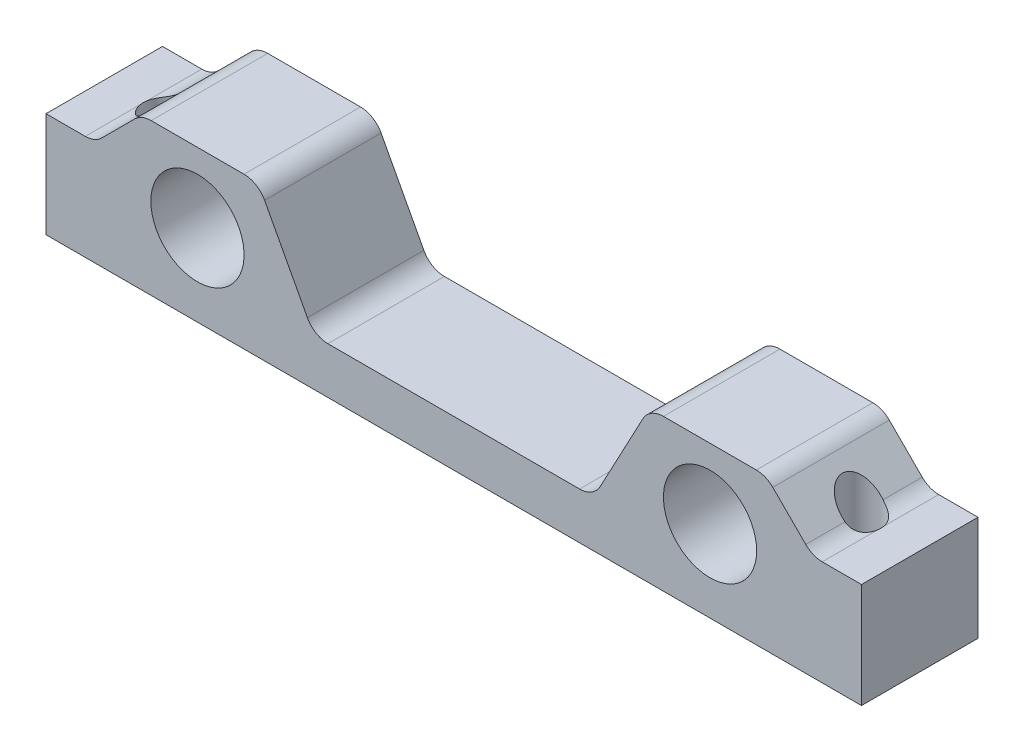
ISO-10303-21;
HEADER;
FILE_DESCRIPTION(('STEP AP214'),'2;1');
FILE_NAME('part.step','',(''),(''),'','','');
FILE_SCHEMA(('AUTOMOTIVE_DESIGN { 1 0 10303 214 1 1 1 1 }'));
ENDSEC;
DATA;
#1=APPLICATION_CONTEXT('core data for automotive mechanical design processes');
#2=APPLICATION_PROTOCOL_DEFINITION('international standard','automotive_design',2000,#1);
#3=PRODUCT_CONTEXT('',#1,'mechanical');
#4=PRODUCT('Part','Part','',(#3));
#5=PRODUCT_RELATED_PRODUCT_CATEGORY('part','',(#4));
#6=PRODUCT_DEFINITION_FORMATION('','',#4);
#7=PRODUCT_DEFINITION_CONTEXT('part definition',#1,'design');
#8=PRODUCT_DEFINITION('design','',#6,#7);
#9=PRODUCT_DEFINITION_SHAPE('','',#8);
#10=(LENGTH_UNIT() NAMED_UNIT(*) SI_UNIT(.MILLI.,.METRE.));
#11=(NAMED_UNIT(*) PLANE_ANGLE_UNIT() SI_UNIT($,.RADIAN.));
#12=(NAMED_UNIT(*) SI_UNIT($,.STERADIAN.) SOLID_ANGLE_UNIT());
#13=UNCERTAINTY_MEASURE_WITH_UNIT(LENGTH_MEASURE(1.E-05),#10,'distance_accuracy_value','');
#14=(GEOMETRIC_REPRESENTATION_CONTEXT(3) GLOBAL_UNCERTAINTY_ASSIGNED_CONTEXT((#13)) GLOBAL_UNIT_ASSIGNED_CONTEXT((#10,
#11,#12)) REPRESENTATION_CONTEXT('',''));
#15=CARTESIAN_POINT('',(0.,0.,0.));
#16=DIRECTION('',(0.,0.,1.));
#17=DIRECTION('',(1.,0.,0.));
#18=AXIS2_PLACEMENT_3D('',#15,#16,#17);
#19=CARTESIAN_POINT('',(31.6284271247462,11.,5.));
#20=DIRECTION('',(0.,0.,1.));
#21=DIRECTION('',(1.,0.,0.));
#22=AXIS2_PLACEMENT_3D('',#19,#20,#21);
#23=CYLINDRICAL_SURFACE('',#22,2.);
#24=DIRECTION('',(0.,0.,-1.));
#25=VECTOR('',#24,1.);
#26=CARTESIAN_POINT('',(31.6284271247462,9.,5.));
#27=LINE('',#26,#25);
#28=CARTESIAN_POINT('',(31.6284271247462,9.,0.265941909805075));
#29=VERTEX_POINT('',#28);
#30=CARTESIAN_POINT('',(31.6284271247462,9.,5.));
#31=VERTEX_POINT('',#30);
#32=EDGE_CURVE('E239',#29,#31,#27,.F.);
#33=ORIENTED_EDGE('',*,*,#32,.F.);
#34=CARTESIAN_POINT('',(31.6284271247462,9.,0.265941909805074));
#35=CARTESIAN_POINT('',(31.621127831852,9.00000971552875,0.310662451399119));
#36=CARTESIAN_POINT('',(31.6119785573823,9.00004017859814,0.355079514265546));
#37=CARTESIAN_POINT('',(31.5900591601242,9.00033544474956,0.44301475024879));
#38=CARTESIAN_POINT('',(31.5772886854256,9.0006002706124,0.486532835561299));
#39=CARTESIAN_POINT('',(31.5481672998002,9.00155850160956,0.572487890355647));
#40=CARTESIAN_POINT('',(31.5318065990873,9.00225308822136,0.614921542548558));
#41=CARTESIAN_POINT('',(31.4956562322412,9.00432988148771,0.698268772917775));
#42=CARTESIAN_POINT('',(31.4758667090317,9.00571205948583,0.73918241436649));
#43=CARTESIAN_POINT('',(31.4114723830346,9.01133260970605,0.85935523220246));
#44=CARTESIAN_POINT('',(31.3618708175915,9.0170451727348,0.935960977413042));
#45=CARTESIAN_POINT('',(31.2512640163631,9.03509143259801,1.07936191713064));
#46=CARTESIAN_POINT('',(31.1902791374809,9.04741338237266,1.14617425032728));
#47=CARTESIAN_POINT('',(31.0631193291675,9.0804953506657,1.26468011590106));
#48=CARTESIAN_POINT('',(30.9973970362461,9.10076831858177,1.31699155259397));
#49=CARTESIAN_POINT('',(30.8615448749838,9.15145352436031,1.4096061400553));
#50=CARTESIAN_POINT('',(30.7914169694037,9.18186127267306,1.44991459301451));
#51=CARTESIAN_POINT('',(30.6573749746826,9.25009117763731,1.51505623876631));
#52=CARTESIAN_POINT('',(30.5934956526785,9.28694917584134,1.54098705040206));
#53=CARTESIAN_POINT('',(30.4682018225293,9.36920771489363,1.58356067225445));
#54=CARTESIAN_POINT('',(30.4067869213124,9.41460688681265,1.60020496916628));
#55=CARTESIAN_POINT('',(30.324709691245,9.4830186246566,1.61790772536496));
#56=CARTESIAN_POINT('',(30.3019941432116,9.50283904814436,1.6222866288439));
#57=CARTESIAN_POINT('',(30.2574428792265,9.54352923400787,1.62994802334597));
#58=CARTESIAN_POINT('',(30.235604978577,9.56439605718387,1.63323340701303));
#59=CARTESIAN_POINT('',(30.2142135623731,9.58578643762691,1.63603561993479));
#60=B_SPLINE_CURVE_WITH_KNOTS('',3,(#34,#35,#36,#37,#38,#39,#40,#41,#42,#43,#44,#45,#46,#47,#48,
#49,#50,#51,#52,#53,#54,#55,#56,#57,#58,#59),.UNSPECIFIED.,.F.,.F.,(4,2,2,2,2,2,2,2,2,2,2,2,4),
(0.,0.135895733799582,0.271804678547935,0.408088928006801,0.54436749808707,0.817191567087051,
1.08953233671039,1.3472932335245,1.60494009770677,1.83839718002303,2.07181687703452,
2.16316987853132,2.25427927064066),.UNSPECIFIED.);
#61=CARTESIAN_POINT('',(30.2142135623731,9.58578643762691,1.63603561993479));
#62=VERTEX_POINT('',#61);
#63=EDGE_CURVE('E11',#29,#62,#60,.T.);
#64=ORIENTED_EDGE('',*,*,#63,.T.);
#65=DIRECTION('',(0.,0.,-1.));
#66=VECTOR('',#65,1.);
#67=CARTESIAN_POINT('',(30.2142135623731,9.58578643762691,-5.));
#68=LINE('',#67,#66);
#69=CARTESIAN_POINT('',(30.2142135623731,9.58578643762691,5.));
#70=VERTEX_POINT('',#69);
#71=EDGE_CURVE('E226',#70,#62,#68,.T.);
#72=ORIENTED_EDGE('',*,*,#71,.F.);
#73=CARTESIAN_POINT('',(31.6284271247462,11.,5.));
#74=DIRECTION('',(0.,0.,-1.));
#75=DIRECTION('',(-1.,0.,0.));
#76=AXIS2_PLACEMENT_3D('',#73,#74,#75);
#77=CIRCLE('',#76,2.);
#78=EDGE_CURVE('E255',#31,#70,#77,.T.);
#79=ORIENTED_EDGE('',*,*,#78,.F.);
#80=EDGE_LOOP('',(#33,#64,#72,#79));
#81=FACE_BOUND('',#80,.T.);
#82=ADVANCED_FACE('F46',(#81),#23,.F.);
#83=CARTESIAN_POINT('',(-31.6284271247462,11.,5.));
#84=DIRECTION('',(0.,0.,1.));
#85=DIRECTION('',(1.,0.,0.));
#86=AXIS2_PLACEMENT_3D('',#83,#84,#85);
#87=CYLINDRICAL_SURFACE('',#86,2.);
#88=DIRECTION('',(0.,0.,-1.));
#89=VECTOR('',#88,1.);
#90=CARTESIAN_POINT('',(-30.2142135623731,9.58578643762691,5.));
#91=LINE('',#90,#89);
#92=CARTESIAN_POINT('',(-30.2142135623731,9.58578643762691,1.63603561993478));
#93=VERTEX_POINT('',#92);
#94=CARTESIAN_POINT('',(-30.2142135623731,9.58578643762691,5.));
#95=VERTEX_POINT('',#94);
#96=EDGE_CURVE('E472',#93,#95,#91,.F.);
#97=ORIENTED_EDGE('',*,*,#96,.F.);
#98=CARTESIAN_POINT('',(-30.2142135623731,9.58578643762691,1.63603561993478));
#99=CARTESIAN_POINT('',(-30.2430124964492,9.55697701470364,1.6322668471346));
#100=CARTESIAN_POINT('',(-30.2726510344877,9.52910887774639,1.62761043362416));
#101=CARTESIAN_POINT('',(-30.3333641502774,9.47538578193443,1.61626773968908));
#102=CARTESIAN_POINT('',(-30.3644396588817,9.44953215801428,1.60958012740766));
#103=CARTESIAN_POINT('',(-30.4277769358833,9.39998196945452,1.59391684706635));
#104=CARTESIAN_POINT('',(-30.4600398692527,9.3762876069667,1.58493887782779));
#105=CARTESIAN_POINT('',(-30.5253647318776,9.33121843055241,1.56450198862892));
#106=CARTESIAN_POINT('',(-30.5584264613024,9.30984304369803,1.55304368356733));
#107=CARTESIAN_POINT('',(-30.6585898278529,9.24914411761824,1.51455142426167));
#108=CARTESIAN_POINT('',(-30.7264221336925,9.21343890838563,1.48345698607709));
#109=CARTESIAN_POINT('',(-30.860259303265,9.15193281366341,1.4100602560433));
#110=CARTESIAN_POINT('',(-30.926267341295,9.1261135680551,1.36777898976578));
#111=CARTESIAN_POINT('',(-31.0494557916138,9.08459654272158,1.27542736857176));
#112=CARTESIAN_POINT('',(-31.1069279197647,9.06838679187342,1.2259722455492));
#113=CARTESIAN_POINT('',(-31.2152285661413,9.0423536241548,1.11872160915702));
#114=CARTESIAN_POINT('',(-31.2660492274388,9.03253770644264,1.06091639888236));
#115=CARTESIAN_POINT('',(-31.3617963127153,9.01722751049113,0.935190957920211));
#116=CARTESIAN_POINT('',(-31.406272936153,9.01198730623311,0.866898913947614));
#117=CARTESIAN_POINT('',(-31.4847077656438,9.00478077183349,0.724399481383092));
#118=CARTESIAN_POINT('',(-31.5186698449035,9.00281323497998,0.650194283695164));
#119=CARTESIAN_POINT('',(-31.5654856982409,9.00090466283946,0.524016182864021));
#120=CARTESIAN_POINT('',(-31.5815780266026,9.00049825109698,0.473223642245167));
#121=CARTESIAN_POINT('',(-31.6087638403447,9.00005476682683,0.37041062173159));
#122=CARTESIAN_POINT('',(-31.6198659671162,9.00001705346553,0.318392429992984));
#123=CARTESIAN_POINT('',(-31.6284271247462,9.,0.265941909805161));
#124=B_SPLINE_CURVE_WITH_KNOTS('',3,(#98,#99,#100,#101,#102,#103,#104,#105,#106,#107,#108,#109,
#110,#111,#112,#113,#114,#115,#116,#117,#118,#119,#120,#121,#122,#123),.UNSPECIFIED.,.F.,.F.,(4,
2,2,2,2,2,2,2,2,2,2,2,4),(0.,0.122713395548171,0.245507428601872,0.368425325145743,
0.491312784007391,0.738028301882362,0.98428337349463,1.21584605216557,1.44767983788197,
1.6916906486659,1.93561146677952,2.09522634897243,2.25456375555555),.UNSPECIFIED.);
#125=CARTESIAN_POINT('',(-31.6284271247462,9.,0.265941909805164));
#126=VERTEX_POINT('',#125);
#127=EDGE_CURVE('E217',#93,#126,#124,.T.);
#128=ORIENTED_EDGE('',*,*,#127,.T.);
#129=DIRECTION('',(0.,0.,-1.));
#130=VECTOR('',#129,1.);
#131=CARTESIAN_POINT('',(-31.6284271247462,9.,-5.));
#132=LINE('',#131,#130);
#133=CARTESIAN_POINT('',(-31.6284271247462,9.,5.));
#134=VERTEX_POINT('',#133);
#135=EDGE_CURVE('E468',#134,#126,#132,.T.);
#136=ORIENTED_EDGE('',*,*,#135,.F.);
#137=CARTESIAN_POINT('',(-31.6284271247462,11.,5.));
#138=DIRECTION('',(0.,0.,-1.));
#139=DIRECTION('',(-1.,0.,0.));
#140=AXIS2_PLACEMENT_3D('',#137,#138,#139);
#141=CIRCLE('',#140,2.);
#142=EDGE_CURVE('E244',#95,#134,#141,.T.);
#143=ORIENTED_EDGE('',*,*,#142,.F.);
#144=EDGE_LOOP('',(#97,#128,#136,#143));
#145=FACE_BOUND('',#144,.T.);
#146=ADVANCED_FACE('F294',(#145),#87,.F.);
#147=CARTESIAN_POINT('',(0.,0.,5.));
#148=DIRECTION('',(0.,0.,-1.));
#149=DIRECTION('',(-1.,0.,0.));
#150=AXIS2_PLACEMENT_3D('',#147,#148,#149);
#151=PLANE('',#150);
#152=DIRECTION('',(-1.,0.,0.));
#153=VECTOR('',#152,1.);
#154=CARTESIAN_POINT('',(-26.8,13.,5.));
#155=LINE('',#154,#153);
#156=CARTESIAN_POINT('',(-18.,13.,5.));
#157=VERTEX_POINT('',#156);
#158=CARTESIAN_POINT('',(-25.9715728752538,13.,5.));
#159=VERTEX_POINT('',#158);
#160=EDGE_CURVE('E506',#157,#159,#155,.T.);
#161=ORIENTED_EDGE('',*,*,#160,.T.);
#162=CARTESIAN_POINT('',(-25.9715728752538,11.,5.));
#163=DIRECTION('',(0.,0.,-1.));
#164=DIRECTION('',(-1.,0.,0.));
#165=AXIS2_PLACEMENT_3D('',#162,#163,#164);
#166=CIRCLE('',#165,2.);
#167=CARTESIAN_POINT('',(-27.3857864376269,12.4142135623731,5.));
#168=VERTEX_POINT('',#167);
#169=EDGE_CURVE('E388',#159,#168,#166,.F.);
#170=ORIENTED_EDGE('',*,*,#169,.T.);
#171=DIRECTION('',(-0.707106781186546,-0.707106781186548,0.));
#172=VECTOR('',#171,1.);
#173=CARTESIAN_POINT('',(-30.8,9.,5.));
#174=LINE('',#173,#172);
#175=EDGE_CURVE('E508',#168,#95,#174,.T.);
#176=ORIENTED_EDGE('',*,*,#175,.T.);
#177=ORIENTED_EDGE('',*,*,#142,.T.);
#178=DIRECTION('',(-1.,0.,0.));
#179=VECTOR('',#178,1.);
#180=CARTESIAN_POINT('',(-35.,9.,5.));
#181=LINE('',#180,#179);
#182=CARTESIAN_POINT('',(-35.,9.,5.));
#183=VERTEX_POINT('',#182);
#184=EDGE_CURVE('E458',#134,#183,#181,.T.);
#185=ORIENTED_EDGE('',*,*,#184,.T.);
#186=DIRECTION('',(0.,-1.,0.));
#187=VECTOR('',#186,1.);
#188=CARTESIAN_POINT('',(-35.,0.,5.));
#189=LINE('',#188,#187);
#190=CARTESIAN_POINT('',(-35.,0.,5.));
#191=VERTEX_POINT('',#190);
#192=EDGE_CURVE('E453',#183,#191,#189,.T.);
#193=ORIENTED_EDGE('',*,*,#192,.T.);
#194=DIRECTION('',(1.,0.,0.));
#195=VECTOR('',#194,1.);
#196=CARTESIAN_POINT('',(-35.,0.,5.));
#197=LINE('',#196,#195);
#198=CARTESIAN_POINT('',(35.,0.,5.));
#199=VERTEX_POINT('',#198);
#200=EDGE_CURVE('E531',#191,#199,#197,.T.);
#201=ORIENTED_EDGE('',*,*,#200,.T.);
#202=DIRECTION('',(0.,1.,0.));
#203=VECTOR('',#202,1.);
#204=CARTESIAN_POINT('',(35.,0.,5.));
#205=LINE('',#204,#203);
#206=CARTESIAN_POINT('',(35.,9.00000000000001,5.));
#207=VERTEX_POINT('',#206);
#208=EDGE_CURVE('E527',#199,#207,#205,.T.);
#209=ORIENTED_EDGE('',*,*,#208,.T.);
#210=DIRECTION('',(-1.,0.,0.));
#211=VECTOR('',#210,1.);
#212=CARTESIAN_POINT('',(35.,9.00000000000001,5.));
#213=LINE('',#212,#211);
#214=EDGE_CURVE('E526',#207,#31,#213,.T.);
#215=ORIENTED_EDGE('',*,*,#214,.T.);
#216=ORIENTED_EDGE('',*,*,#78,.T.);
#217=DIRECTION('',(-0.707106781186547,0.707106781186548,0.));
#218=VECTOR('',#217,1.);
#219=CARTESIAN_POINT('',(30.8,9.,5.));
#220=LINE('',#219,#218);
#221=CARTESIAN_POINT('',(27.3857864376269,12.4142135623731,5.));
#222=VERTEX_POINT('',#221);
#223=EDGE_CURVE('E500',#70,#222,#220,.T.);
#224=ORIENTED_EDGE('',*,*,#223,.T.);
#225=CARTESIAN_POINT('',(25.9715728752538,11.,5.));
#226=DIRECTION('',(0.,0.,-1.));
#227=DIRECTION('',(-1.,0.,0.));
#228=AXIS2_PLACEMENT_3D('',#225,#226,#227);
#229=CIRCLE('',#228,2.);
#230=CARTESIAN_POINT('',(25.9715728752538,13.,5.));
#231=VERTEX_POINT('',#230);
#232=EDGE_CURVE('E486',#222,#231,#229,.F.);
#233=ORIENTED_EDGE('',*,*,#232,.T.);
#234=DIRECTION('',(-1.,0.,0.));
#235=VECTOR('',#234,1.);
#236=CARTESIAN_POINT('',(26.8,13.,5.));
#237=LINE('',#236,#235);
#238=CARTESIAN_POINT('',(18.,13.,5.));
#239=VERTEX_POINT('',#238);
#240=EDGE_CURVE('E423',#231,#239,#237,.T.);
#241=ORIENTED_EDGE('',*,*,#240,.T.);
#242=CARTESIAN_POINT('',(18.,11.,5.));
#243=DIRECTION('',(0.,0.,-1.));
#244=DIRECTION('',(-1.,0.,0.));
#245=AXIS2_PLACEMENT_3D('',#242,#243,#244);
#246=CIRCLE('',#245,2.);
#247=CARTESIAN_POINT('',(16.2352941176471,11.9411764705882,5.));
#248=VERTEX_POINT('',#247);
#249=EDGE_CURVE('E401',#239,#248,#246,.F.);
#250=ORIENTED_EDGE('',*,*,#249,.T.);
#251=DIRECTION('',(-0.470588235294119,-0.88235294117647,0.));
#252=VECTOR('',#251,1.);
#253=CARTESIAN_POINT('',(16.8,13.,5.));
#254=LINE('',#253,#252);
#255=CARTESIAN_POINT('',(12.5647058823529,5.05882352941176,5.));
#256=VERTEX_POINT('',#255);
#257=EDGE_CURVE('E491',#248,#256,#254,.T.);
#258=ORIENTED_EDGE('',*,*,#257,.T.);
#259=CARTESIAN_POINT('',(10.8,6.,5.));
#260=DIRECTION('',(0.,0.,-1.));
#261=DIRECTION('',(-1.,0.,0.));
#262=AXIS2_PLACEMENT_3D('',#259,#260,#261);
#263=CIRCLE('',#262,2.);
#264=CARTESIAN_POINT('',(10.8,4.,5.));
#265=VERTEX_POINT('',#264);
#266=EDGE_CURVE('E252',#256,#265,#263,.T.);
#267=ORIENTED_EDGE('',*,*,#266,.T.);
#268=DIRECTION('',(-1.,0.,0.));
#269=VECTOR('',#268,1.);
#270=CARTESIAN_POINT('',(12.,4.,5.));
#271=LINE('',#270,#269);
#272=CARTESIAN_POINT('',(-10.8,4.,5.));
#273=VERTEX_POINT('',#272);
#274=EDGE_CURVE('E495',#265,#273,#271,.T.);
#275=ORIENTED_EDGE('',*,*,#274,.T.);
#276=CARTESIAN_POINT('',(-10.8,6.,5.));
#277=DIRECTION('',(0.,0.,-1.));
#278=DIRECTION('',(-1.,0.,0.));
#279=AXIS2_PLACEMENT_3D('',#276,#277,#278);
#280=CIRCLE('',#279,2.);
#281=CARTESIAN_POINT('',(-12.5647058823529,5.05882352941176,5.));
#282=VERTEX_POINT('',#281);
#283=EDGE_CURVE('E248',#273,#282,#280,.T.);
#284=ORIENTED_EDGE('',*,*,#283,.T.);
#285=DIRECTION('',(-0.47058823529412,0.88235294117647,0.));
#286=VECTOR('',#285,1.);
#287=CARTESIAN_POINT('',(-16.8,13.,5.));
#288=LINE('',#287,#286);
#289=CARTESIAN_POINT('',(-16.2352941176471,11.9411764705882,5.));
#290=VERTEX_POINT('',#289);
#291=EDGE_CURVE('E498',#282,#290,#288,.T.);
#292=ORIENTED_EDGE('',*,*,#291,.T.);
#293=CARTESIAN_POINT('',(-18.,11.,5.));
#294=DIRECTION('',(0.,0.,-1.));
#295=DIRECTION('',(-1.,0.,0.));
#296=AXIS2_PLACEMENT_3D('',#293,#294,#295);
#297=CIRCLE('',#296,2.);
#298=EDGE_CURVE('E396',#290,#157,#297,.F.);
#299=ORIENTED_EDGE('',*,*,#298,.T.);
#300=EDGE_LOOP('',(#161,#170,#176,#177,#185,#193,#201,#209,#215,#216,#224,#233,#241,#250,#258,
#267,#275,#284,#292,#299));
#301=FACE_BOUND('',#300,.T.);
#302=CARTESIAN_POINT('',(22.,7.00000000000001,5.));
#303=DIRECTION('',(0.,0.,1.));
#304=DIRECTION('',(1.,0.,0.));
#305=AXIS2_PLACEMENT_3D('',#302,#303,#304);
#306=CIRCLE('',#305,4.);
#307=CARTESIAN_POINT('',(26.,7.00000000000001,5.));
#308=VERTEX_POINT('',#307);
#309=EDGE_CURVE('E514',#308,#308,#306,.T.);
#310=ORIENTED_EDGE('',*,*,#309,.F.);
#311=EDGE_LOOP('',(#310));
#312=FACE_BOUND('',#311,.T.);
#313=CARTESIAN_POINT('',(-22.,7.00000000000001,5.));
#314=DIRECTION('',(0.,0.,1.));
#315=DIRECTION('',(-1.,0.,0.));
#316=AXIS2_PLACEMENT_3D('',#313,#314,#315);
#317=CIRCLE('',#316,4.);
#318=CARTESIAN_POINT('',(-26.,7.00000000000001,5.));
#319=VERTEX_POINT('',#318);
#320=EDGE_CURVE('E538',#319,#319,#317,.T.);
#321=ORIENTED_EDGE('',*,*,#320,.F.);
#322=EDGE_LOOP('',(#321));
#323=FACE_BOUND('',#322,.T.);
#324=ADVANCED_FACE('F290',(#301,#312,#323),#151,.F.);
#325=CARTESIAN_POINT('',(0.,0.,-5.));
#326=DIRECTION('',(0.,0.,-1.));
#327=DIRECTION('',(-1.,0.,0.));
#328=AXIS2_PLACEMENT_3D('',#325,#326,#327);
#329=PLANE('',#328);
#330=CARTESIAN_POINT('',(22.,7.00000000000001,-5.));
#331=DIRECTION('',(0.,0.,1.));
#332=DIRECTION('',(1.,0.,0.));
#333=AXIS2_PLACEMENT_3D('',#330,#331,#332);
#334=CIRCLE('',#333,4.);
#335=CARTESIAN_POINT('',(26.,7.00000000000001,-5.));
#336=VERTEX_POINT('',#335);
#337=EDGE_CURVE('E535',#336,#336,#334,.T.);
#338=ORIENTED_EDGE('',*,*,#337,.T.);
#339=EDGE_LOOP('',(#338));
#340=FACE_BOUND('',#339,.T.);
#341=DIRECTION('',(-0.707106781186546,-0.707106781186548,0.));
#342=VECTOR('',#341,1.);
#343=CARTESIAN_POINT('',(-30.8,9.,-5.));
#344=LINE('',#343,#342);
#345=CARTESIAN_POINT('',(-27.3857864376269,12.4142135623731,-5.));
#346=VERTEX_POINT('',#345);
#347=CARTESIAN_POINT('',(-30.2142135623731,9.58578643762691,-5.));
#348=VERTEX_POINT('',#347);
#349=EDGE_CURVE('E448',#346,#348,#344,.T.);
#350=ORIENTED_EDGE('',*,*,#349,.F.);
#351=CARTESIAN_POINT('',(-25.9715728752538,11.,-5.));
#352=DIRECTION('',(0.,0.,-1.));
#353=DIRECTION('',(-1.,0.,0.));
#354=AXIS2_PLACEMENT_3D('',#351,#352,#353);
#355=CIRCLE('',#354,2.);
#356=CARTESIAN_POINT('',(-25.9715728752538,13.,-5.));
#357=VERTEX_POINT('',#356);
#358=EDGE_CURVE('E480',#346,#357,#355,.T.);
#359=ORIENTED_EDGE('',*,*,#358,.T.);
#360=DIRECTION('',(-1.,0.,0.));
#361=VECTOR('',#360,1.);
#362=CARTESIAN_POINT('',(-26.8,13.,-5.));
#363=LINE('',#362,#361);
#364=CARTESIAN_POINT('',(-18.,13.,-5.));
#365=VERTEX_POINT('',#364);
#366=EDGE_CURVE('E445',#365,#357,#363,.T.);
#367=ORIENTED_EDGE('',*,*,#366,.F.);
#368=CARTESIAN_POINT('',(-18.,11.,-5.));
#369=DIRECTION('',(0.,0.,-1.));
#370=DIRECTION('',(-1.,0.,0.));
#371=AXIS2_PLACEMENT_3D('',#368,#369,#370);
#372=CIRCLE('',#371,2.);
#373=CARTESIAN_POINT('',(-16.2352941176471,11.9411764705882,-5.));
#374=VERTEX_POINT('',#373);
#375=EDGE_CURVE('E478',#365,#374,#372,.T.);
#376=ORIENTED_EDGE('',*,*,#375,.T.);
#377=DIRECTION('',(-0.47058823529412,0.88235294117647,0.));
#378=VECTOR('',#377,1.);
#379=CARTESIAN_POINT('',(-16.8,13.,-5.));
#380=LINE('',#379,#378);
#381=CARTESIAN_POINT('',(-12.5647058823529,5.05882352941176,-5.));
#382=VERTEX_POINT('',#381);
#383=EDGE_CURVE('E442',#382,#374,#380,.T.);
#384=ORIENTED_EDGE('',*,*,#383,.F.);
#385=CARTESIAN_POINT('',(-10.8,6.,-5.));
#386=DIRECTION('',(0.,0.,-1.));
#387=DIRECTION('',(-1.,0.,0.));
#388=AXIS2_PLACEMENT_3D('',#385,#386,#387);
#389=CIRCLE('',#388,2.);
#390=CARTESIAN_POINT('',(-10.8,4.,-5.));
#391=VERTEX_POINT('',#390);
#392=EDGE_CURVE('E246',#382,#391,#389,.F.);
#393=ORIENTED_EDGE('',*,*,#392,.T.);
#394=DIRECTION('',(-1.,0.,0.));
#395=VECTOR('',#394,1.);
#396=CARTESIAN_POINT('',(12.,4.,-5.));
#397=LINE('',#396,#395);
#398=CARTESIAN_POINT('',(10.8,4.,-5.));
#399=VERTEX_POINT('',#398);
#400=EDGE_CURVE('E434',#399,#391,#397,.T.);
#401=ORIENTED_EDGE('',*,*,#400,.F.);
#402=CARTESIAN_POINT('',(10.8,6.,-5.));
#403=DIRECTION('',(0.,0.,-1.));
#404=DIRECTION('',(-1.,0.,0.));
#405=AXIS2_PLACEMENT_3D('',#402,#403,#404);
#406=CIRCLE('',#405,2.);
#407=CARTESIAN_POINT('',(12.5647058823529,5.05882352941176,-5.));
#408=VERTEX_POINT('',#407);
#409=EDGE_CURVE('E250',#399,#408,#406,.F.);
#410=ORIENTED_EDGE('',*,*,#409,.T.);
#411=DIRECTION('',(-0.470588235294119,-0.88235294117647,0.));
#412=VECTOR('',#411,1.);
#413=CARTESIAN_POINT('',(16.8,13.,-5.));
#414=LINE('',#413,#412);
#415=CARTESIAN_POINT('',(16.2352941176471,11.9411764705882,-5.));
#416=VERTEX_POINT('',#415);
#417=EDGE_CURVE('E430',#416,#408,#414,.T.);
#418=ORIENTED_EDGE('',*,*,#417,.F.);
#419=CARTESIAN_POINT('',(18.,11.,-5.));
#420=DIRECTION('',(0.,0.,-1.));
#421=DIRECTION('',(-1.,0.,0.));
#422=AXIS2_PLACEMENT_3D('',#419,#420,#421);
#423=CIRCLE('',#422,2.);
#424=CARTESIAN_POINT('',(18.,13.,-5.));
#425=VERTEX_POINT('',#424);
#426=EDGE_CURVE('E429',#416,#425,#423,.T.);
#427=ORIENTED_EDGE('',*,*,#426,.T.);
#428=DIRECTION('',(-1.,0.,0.));
#429=VECTOR('',#428,1.);
#430=CARTESIAN_POINT('',(26.8,13.,-5.));
#431=LINE('',#430,#429);
#432=CARTESIAN_POINT('',(25.9715728752538,13.,-5.));
#433=VERTEX_POINT('',#432);
#434=EDGE_CURVE('E420',#433,#425,#431,.T.);
#435=ORIENTED_EDGE('',*,*,#434,.F.);
#436=CARTESIAN_POINT('',(25.9715728752538,11.,-5.));
#437=DIRECTION('',(0.,0.,-1.));
#438=DIRECTION('',(-1.,0.,0.));
#439=AXIS2_PLACEMENT_3D('',#436,#437,#438);
#440=CIRCLE('',#439,2.);
#441=CARTESIAN_POINT('',(27.3857864376269,12.4142135623731,-5.));
#442=VERTEX_POINT('',#441);
#443=EDGE_CURVE('E427',#433,#442,#440,.T.);
#444=ORIENTED_EDGE('',*,*,#443,.T.);
#445=DIRECTION('',(-0.707106781186547,0.707106781186548,0.));
#446=VECTOR('',#445,1.);
#447=CARTESIAN_POINT('',(30.8,9.,-5.));
#448=LINE('',#447,#446);
#449=CARTESIAN_POINT('',(30.2142135623731,9.58578643762691,-5.));
#450=VERTEX_POINT('',#449);
#451=EDGE_CURVE('E431',#450,#442,#448,.T.);
#452=ORIENTED_EDGE('',*,*,#451,.F.);
#453=CARTESIAN_POINT('',(31.6284271247462,11.,-5.));
#454=DIRECTION('',(0.,0.,-1.));
#455=DIRECTION('',(-1.,0.,0.));
#456=AXIS2_PLACEMENT_3D('',#453,#454,#455);
#457=CIRCLE('',#456,2.);
#458=CARTESIAN_POINT('',(31.6284271247462,9.,-5.));
#459=VERTEX_POINT('',#458);
#460=EDGE_CURVE('E229',#450,#459,#457,.F.);
#461=ORIENTED_EDGE('',*,*,#460,.T.);
#462=DIRECTION('',(-1.,0.,0.));
#463=VECTOR('',#462,1.);
#464=CARTESIAN_POINT('',(35.,9.00000000000001,-5.));
#465=LINE('',#464,#463);
#466=CARTESIAN_POINT('',(35.,9.00000000000001,-5.));
#467=VERTEX_POINT('',#466);
#468=EDGE_CURVE('E436',#467,#459,#465,.T.);
#469=ORIENTED_EDGE('',*,*,#468,.F.);
#470=DIRECTION('',(0.,1.,0.));
#471=VECTOR('',#470,1.);
#472=CARTESIAN_POINT('',(35.,0.,-5.));
#473=LINE('',#472,#471);
#474=CARTESIAN_POINT('',(35.,0.,-5.));
#475=VERTEX_POINT('',#474);
#476=EDGE_CURVE('E516',#475,#467,#473,.T.);
#477=ORIENTED_EDGE('',*,*,#476,.F.);
#478=DIRECTION('',(1.,0.,0.));
#479=VECTOR('',#478,1.);
#480=CARTESIAN_POINT('',(-35.,0.,-5.));
#481=LINE('',#480,#479);
#482=CARTESIAN_POINT('',(-35.,0.,-5.));
#483=VERTEX_POINT('',#482);
#484=EDGE_CURVE('E513',#483,#475,#481,.T.);
#485=ORIENTED_EDGE('',*,*,#484,.F.);
#486=DIRECTION('',(0.,-1.,0.));
#487=VECTOR('',#486,1.);
#488=CARTESIAN_POINT('',(-35.,0.,-5.));
#489=LINE('',#488,#487);
#490=CARTESIAN_POINT('',(-35.,9.,-5.));
#491=VERTEX_POINT('',#490);
#492=EDGE_CURVE('E511',#491,#483,#489,.T.);
#493=ORIENTED_EDGE('',*,*,#492,.F.);
#494=DIRECTION('',(-1.,0.,0.));
#495=VECTOR('',#494,1.);
#496=CARTESIAN_POINT('',(-35.,9.,-5.));
#497=LINE('',#496,#495);
#498=CARTESIAN_POINT('',(-31.6284271247462,9.,-5.));
#499=VERTEX_POINT('',#498);
#500=EDGE_CURVE('E451',#499,#491,#497,.T.);
#501=ORIENTED_EDGE('',*,*,#500,.F.);
#502=CARTESIAN_POINT('',(-31.6284271247462,11.,-5.));
#503=DIRECTION('',(0.,0.,-1.));
#504=DIRECTION('',(-1.,0.,0.));
#505=AXIS2_PLACEMENT_3D('',#502,#503,#504);
#506=CIRCLE('',#505,2.);
#507=EDGE_CURVE('E242',#499,#348,#506,.F.);
#508=ORIENTED_EDGE('',*,*,#507,.T.);
#509=EDGE_LOOP('',(#350,#359,#367,#376,#384,#393,#401,#410,#418,#427,#435,#444,#452,#461,#469,
#477,#485,#493,#501,#508));
#510=FACE_BOUND('',#509,.T.);
#511=CARTESIAN_POINT('',(-22.,7.00000000000001,-5.));
#512=DIRECTION('',(0.,0.,1.));
#513=DIRECTION('',(-1.,0.,0.));
#514=AXIS2_PLACEMENT_3D('',#511,#512,#513);
#515=CIRCLE('',#514,4.);
#516=CARTESIAN_POINT('',(-26.,7.00000000000001,-5.));
#517=VERTEX_POINT('',#516);
#518=EDGE_CURVE('E541',#517,#517,#515,.T.);
#519=ORIENTED_EDGE('',*,*,#518,.T.);
#520=EDGE_LOOP('',(#519));
#521=FACE_BOUND('',#520,.T.);
#522=ADVANCED_FACE('F293',(#340,#510,#521),#329,.T.);
#523=CARTESIAN_POINT('',(-35.,0.,5.));
#524=DIRECTION('',(1.,0.,0.));
#525=DIRECTION('',(0.,0.,-1.));
#526=AXIS2_PLACEMENT_3D('',#523,#524,#525);
#527=PLANE('',#526);
#528=ORIENTED_EDGE('',*,*,#492,.T.);
#529=DIRECTION('',(0.,0.,-1.));
#530=VECTOR('',#529,1.);
#531=CARTESIAN_POINT('',(-35.,0.,5.));
#532=LINE('',#531,#530);
#533=EDGE_CURVE('E464',#191,#483,#532,.T.);
#534=ORIENTED_EDGE('',*,*,#533,.F.);
#535=ORIENTED_EDGE('',*,*,#192,.F.);
#536=DIRECTION('',(0.,0.,-1.));
#537=VECTOR('',#536,1.);
#538=CARTESIAN_POINT('',(-35.,9.,5.));
#539=LINE('',#538,#537);
#540=EDGE_CURVE('E454',#183,#491,#539,.T.);
#541=ORIENTED_EDGE('',*,*,#540,.T.);
#542=EDGE_LOOP('',(#528,#534,#535,#541));
#543=FACE_BOUND('',#542,.T.);
#544=ADVANCED_FACE('F298',(#543),#527,.F.);
#545=CARTESIAN_POINT('',(-35.,0.,5.));
#546=DIRECTION('',(0.,1.,0.));
#547=DIRECTION('',(-1.,0.,0.));
#548=AXIS2_PLACEMENT_3D('',#545,#546,#547);
#549=PLANE('',#548);
#550=CARTESIAN_POINT('',(30.,0.,0.));
#551=DIRECTION('',(0.,-1.,0.));
#552=DIRECTION('',(0.,0.,-1.));
#553=AXIS2_PLACEMENT_3D('',#550,#551,#552);
#554=CIRCLE('',#553,2.025);
#555=CARTESIAN_POINT('',(30.,0.,-2.025));
#556=VERTEX_POINT('',#555);
#557=EDGE_CURVE('E559',#556,#556,#554,.T.);
#558=ORIENTED_EDGE('',*,*,#557,.F.);
#559=EDGE_LOOP('',(#558));
#560=FACE_BOUND('',#559,.T.);
#561=CARTESIAN_POINT('',(-30.,0.,0.));
#562=DIRECTION('',(0.,-1.,0.));
#563=DIRECTION('',(0.,0.,-1.));
#564=AXIS2_PLACEMENT_3D('',#561,#562,#563);
#565=CIRCLE('',#564,2.025);
#566=CARTESIAN_POINT('',(-30.,0.,-2.02500000000001));
#567=VERTEX_POINT('',#566);
#568=EDGE_CURVE('E553',#567,#567,#565,.T.);
#569=ORIENTED_EDGE('',*,*,#568,.F.);
#570=EDGE_LOOP('',(#569));
#571=FACE_BOUND('',#570,.T.);
#572=ORIENTED_EDGE('',*,*,#484,.T.);
#573=DIRECTION('',(0.,0.,-1.));
#574=VECTOR('',#573,1.);
#575=CARTESIAN_POINT('',(35.,0.,5.));
#576=LINE('',#575,#574);
#577=EDGE_CURVE('E461',#199,#475,#576,.T.);
#578=ORIENTED_EDGE('',*,*,#577,.F.);
#579=ORIENTED_EDGE('',*,*,#200,.F.);
#580=ORIENTED_EDGE('',*,*,#533,.T.);
#581=EDGE_LOOP('',(#572,#578,#579,#580));
#582=FACE_BOUND('',#581,.T.);
#583=ADVANCED_FACE('F336',(#560,#571,#582),#549,.F.);
#584=CARTESIAN_POINT('',(35.,0.,5.));
#585=DIRECTION('',(-1.,0.,0.));
#586=DIRECTION('',(0.,0.,1.));
#587=AXIS2_PLACEMENT_3D('',#584,#585,#586);
#588=PLANE('',#587);
#589=ORIENTED_EDGE('',*,*,#476,.T.);
#590=DIRECTION('',(0.,0.,-1.));
#591=VECTOR('',#590,1.);
#592=CARTESIAN_POINT('',(35.,9.00000000000001,5.));
#593=LINE('',#592,#591);
#594=EDGE_CURVE('E457',#207,#467,#593,.T.);
#595=ORIENTED_EDGE('',*,*,#594,.F.);
#596=ORIENTED_EDGE('',*,*,#208,.F.);
#597=ORIENTED_EDGE('',*,*,#577,.T.);
#598=EDGE_LOOP('',(#589,#595,#596,#597));
#599=FACE_BOUND('',#598,.T.);
#600=ADVANCED_FACE('F332',(#599),#588,.F.);
#601=CARTESIAN_POINT('',(35.,9.00000000000001,5.));
#602=DIRECTION('',(0.,-1.,0.));
#603=DIRECTION('',(1.,0.,0.));
#604=AXIS2_PLACEMENT_3D('',#601,#602,#603);
#605=PLANE('',#604);
#606=CARTESIAN_POINT('',(31.6284271247462,9.,-0.265941909805074));
#607=VERTEX_POINT('',#606);
#608=EDGE_CURVE('E240',#459,#607,#27,.F.);
#609=ORIENTED_EDGE('',*,*,#608,.T.);
#610=CARTESIAN_POINT('',(30.,9.,0.));
#611=DIRECTION('',(0.,-1.,0.));
#612=DIRECTION('',(1.,0.,0.));
#613=AXIS2_PLACEMENT_3D('',#610,#611,#612);
#614=CIRCLE('',#613,1.65);
#615=EDGE_CURVE('E67',#607,#29,#614,.T.);
#616=ORIENTED_EDGE('',*,*,#615,.T.);
#617=ORIENTED_EDGE('',*,*,#32,.T.);
#618=ORIENTED_EDGE('',*,*,#214,.F.);
#619=ORIENTED_EDGE('',*,*,#594,.T.);
#620=ORIENTED_EDGE('',*,*,#468,.T.);
#621=EDGE_LOOP('',(#609,#616,#617,#618,#619,#620));
#622=FACE_BOUND('',#621,.T.);
#623=ADVANCED_FACE('F329',(#622),#605,.F.);
#624=CARTESIAN_POINT('',(30.8,9.,5.));
#625=DIRECTION('',(-0.707106781186548,-0.707106781186547,0.));
#626=DIRECTION('',(0.707106781186547,-0.707106781186548,0.));
#627=AXIS2_PLACEMENT_3D('',#624,#625,#626);
#628=PLANE('',#627);
#629=ORIENTED_EDGE('',*,*,#71,.T.);
#630=CARTESIAN_POINT('',(30.,9.80000000000001,0.));
#631=DIRECTION('',(-0.707106781186548,-0.707106781186547,0.));
#632=DIRECTION('',(0.707106781186547,-0.707106781186548,0.));
#633=AXIS2_PLACEMENT_3D('',#630,#631,#632);
#634=ELLIPSE('',#633,2.3334523779156,1.65);
#635=CARTESIAN_POINT('',(30.2142135623731,9.58578643762691,-1.63603561993479));
#636=VERTEX_POINT('',#635);
#637=EDGE_CURVE('E212',#62,#636,#634,.T.);
#638=ORIENTED_EDGE('',*,*,#637,.T.);
#639=EDGE_CURVE('E222',#636,#450,#68,.T.);
#640=ORIENTED_EDGE('',*,*,#639,.T.);
#641=ORIENTED_EDGE('',*,*,#451,.T.);
#642=DIRECTION('',(0.,0.,-1.));
#643=VECTOR('',#642,1.);
#644=CARTESIAN_POINT('',(27.3857864376269,12.4142135623731,5.));
#645=LINE('',#644,#643);
#646=EDGE_CURVE('E233',#442,#222,#645,.F.);
#647=ORIENTED_EDGE('',*,*,#646,.T.);
#648=ORIENTED_EDGE('',*,*,#223,.F.);
#649=EDGE_LOOP('',(#629,#638,#640,#641,#647,#648));
#650=FACE_BOUND('',#649,.T.);
#651=ADVANCED_FACE('F220',(#650),#628,.F.);
#652=CARTESIAN_POINT('',(26.8,13.,5.));
#653=DIRECTION('',(0.,-1.,0.));
#654=DIRECTION('',(1.,0.,0.));
#655=AXIS2_PLACEMENT_3D('',#652,#653,#654);
#656=PLANE('',#655);
#657=ORIENTED_EDGE('',*,*,#434,.T.);
#658=DIRECTION('',(0.,0.,-1.));
#659=VECTOR('',#658,1.);
#660=CARTESIAN_POINT('',(18.,13.,5.));
#661=LINE('',#660,#659);
#662=EDGE_CURVE('E231',#425,#239,#661,.F.);
#663=ORIENTED_EDGE('',*,*,#662,.T.);
#664=ORIENTED_EDGE('',*,*,#240,.F.);
#665=DIRECTION('',(0.,0.,-1.));
#666=VECTOR('',#665,1.);
#667=CARTESIAN_POINT('',(25.9715728752538,13.,5.));
#668=LINE('',#667,#666);
#669=EDGE_CURVE('E234',#231,#433,#668,.T.);
#670=ORIENTED_EDGE('',*,*,#669,.T.);
#671=EDGE_LOOP('',(#657,#663,#664,#670));
#672=FACE_BOUND('',#671,.T.);
#673=ADVANCED_FACE('F322',(#672),#656,.F.);
#674=CARTESIAN_POINT('',(16.8,13.,5.));
#675=DIRECTION('',(0.88235294117647,-0.470588235294119,0.));
#676=DIRECTION('',(0.470588235294119,0.88235294117647,0.));
#677=AXIS2_PLACEMENT_3D('',#674,#675,#676);
#678=PLANE('',#677);
#679=ORIENTED_EDGE('',*,*,#417,.T.);
#680=DIRECTION('',(0.,0.,-1.));
#681=VECTOR('',#680,1.);
#682=CARTESIAN_POINT('',(12.5647058823529,5.05882352941176,5.));
#683=LINE('',#682,#681);
#684=EDGE_CURVE('E414',#408,#256,#683,.F.);
#685=ORIENTED_EDGE('',*,*,#684,.T.);
#686=ORIENTED_EDGE('',*,*,#257,.F.);
#687=DIRECTION('',(0.,0.,-1.));
#688=VECTOR('',#687,1.);
#689=CARTESIAN_POINT('',(16.2352941176471,11.9411764705882,5.));
#690=LINE('',#689,#688);
#691=EDGE_CURVE('E411',#248,#416,#690,.T.);
#692=ORIENTED_EDGE('',*,*,#691,.T.);
#693=EDGE_LOOP('',(#679,#685,#686,#692));
#694=FACE_BOUND('',#693,.T.);
#695=ADVANCED_FACE('F318',(#694),#678,.F.);
#696=CARTESIAN_POINT('',(12.,4.,5.));
#697=DIRECTION('',(0.,-1.,0.));
#698=DIRECTION('',(0.,0.,-1.));
#699=AXIS2_PLACEMENT_3D('',#696,#697,#698);
#700=PLANE('',#699);
#701=ORIENTED_EDGE('',*,*,#400,.T.);
#702=DIRECTION('',(0.,0.,-1.));
#703=VECTOR('',#702,1.);
#704=CARTESIAN_POINT('',(-10.8,4.,5.));
#705=LINE('',#704,#703);
#706=EDGE_CURVE('E409',#391,#273,#705,.F.);
#707=ORIENTED_EDGE('',*,*,#706,.T.);
#708=ORIENTED_EDGE('',*,*,#274,.F.);
#709=DIRECTION('',(0.,0.,-1.));
#710=VECTOR('',#709,1.);
#711=CARTESIAN_POINT('',(10.8,4.,-5.));
#712=LINE('',#711,#710);
#713=EDGE_CURVE('E406',#265,#399,#712,.T.);
#714=ORIENTED_EDGE('',*,*,#713,.T.);
#715=EDGE_LOOP('',(#701,#707,#708,#714));
#716=FACE_BOUND('',#715,.T.);
#717=ADVANCED_FACE('F314',(#716),#700,.F.);
#718=CARTESIAN_POINT('',(-16.8,13.,5.));
#719=DIRECTION('',(-0.88235294117647,-0.47058823529412,0.));
#720=DIRECTION('',(0.47058823529412,-0.88235294117647,0.));
#721=AXIS2_PLACEMENT_3D('',#718,#719,#720);
#722=PLANE('',#721);
#723=ORIENTED_EDGE('',*,*,#383,.T.);
#724=DIRECTION('',(0.,0.,-1.));
#725=VECTOR('',#724,1.);
#726=CARTESIAN_POINT('',(-16.2352941176471,11.9411764705882,5.));
#727=LINE('',#726,#725);
#728=EDGE_CURVE('E399',#374,#290,#727,.F.);
#729=ORIENTED_EDGE('',*,*,#728,.T.);
#730=ORIENTED_EDGE('',*,*,#291,.F.);
#731=DIRECTION('',(0.,0.,-1.));
#732=VECTOR('',#731,1.);
#733=CARTESIAN_POINT('',(-12.5647058823529,5.05882352941176,-5.));
#734=LINE('',#733,#732);
#735=EDGE_CURVE('E395',#282,#382,#734,.T.);
#736=ORIENTED_EDGE('',*,*,#735,.T.);
#737=EDGE_LOOP('',(#723,#729,#730,#736));
#738=FACE_BOUND('',#737,.T.);
#739=ADVANCED_FACE('F310',(#738),#722,.F.);
#740=CARTESIAN_POINT('',(-26.8,13.,5.));
#741=DIRECTION('',(0.,-1.,0.));
#742=DIRECTION('',(1.,0.,0.));
#743=AXIS2_PLACEMENT_3D('',#740,#741,#742);
#744=PLANE('',#743);
#745=ORIENTED_EDGE('',*,*,#366,.T.);
#746=DIRECTION('',(0.,0.,-1.));
#747=VECTOR('',#746,1.);
#748=CARTESIAN_POINT('',(-25.9715728752538,13.,5.));
#749=LINE('',#748,#747);
#750=EDGE_CURVE('E389',#357,#159,#749,.F.);
#751=ORIENTED_EDGE('',*,*,#750,.T.);
#752=ORIENTED_EDGE('',*,*,#160,.F.);
#753=DIRECTION('',(0.,0.,-1.));
#754=VECTOR('',#753,1.);
#755=CARTESIAN_POINT('',(-18.,13.,5.));
#756=LINE('',#755,#754);
#757=EDGE_CURVE('E482',#157,#365,#756,.T.);
#758=ORIENTED_EDGE('',*,*,#757,.T.);
#759=EDGE_LOOP('',(#745,#751,#752,#758));
#760=FACE_BOUND('',#759,.T.);
#761=ADVANCED_FACE('F306',(#760),#744,.F.);
#762=CARTESIAN_POINT('',(-30.8,9.,5.));
#763=DIRECTION('',(0.707106781186549,-0.707106781186546,0.));
#764=DIRECTION('',(0.707106781186546,0.707106781186549,0.));
#765=AXIS2_PLACEMENT_3D('',#762,#763,#764);
#766=PLANE('',#765);
#767=CARTESIAN_POINT('',(-30.2142135623731,9.58578643762691,-1.6360356199348));
#768=VERTEX_POINT('',#767);
#769=EDGE_CURVE('E473',#348,#768,#91,.F.);
#770=ORIENTED_EDGE('',*,*,#769,.T.);
#771=CARTESIAN_POINT('',(-30.,9.80000000000001,0.));
#772=DIRECTION('',(0.707106781186549,-0.707106781186546,0.));
#773=DIRECTION('',(-0.707106781186546,-0.707106781186549,0.));
#774=AXIS2_PLACEMENT_3D('',#771,#772,#773);
#775=ELLIPSE('',#774,2.33345237791561,1.65);
#776=EDGE_CURVE('E75',#768,#93,#775,.T.);
#777=ORIENTED_EDGE('',*,*,#776,.T.);
#778=ORIENTED_EDGE('',*,*,#96,.T.);
#779=ORIENTED_EDGE('',*,*,#175,.F.);
#780=DIRECTION('',(0.,0.,-1.));
#781=VECTOR('',#780,1.);
#782=CARTESIAN_POINT('',(-27.3857864376269,12.4142135623731,5.));
#783=LINE('',#782,#781);
#784=EDGE_CURVE('E391',#168,#346,#783,.T.);
#785=ORIENTED_EDGE('',*,*,#784,.T.);
#786=ORIENTED_EDGE('',*,*,#349,.T.);
#787=EDGE_LOOP('',(#770,#777,#778,#779,#785,#786));
#788=FACE_BOUND('',#787,.T.);
#789=ADVANCED_FACE('F302',(#788),#766,.F.);
#790=CARTESIAN_POINT('',(-35.,9.,5.));
#791=DIRECTION('',(0.,-1.,0.));
#792=DIRECTION('',(0.,0.,-1.));
#793=AXIS2_PLACEMENT_3D('',#790,#791,#792);
#794=PLANE('',#793);
#795=ORIENTED_EDGE('',*,*,#135,.T.);
#796=CARTESIAN_POINT('',(-30.,9.,0.));
#797=DIRECTION('',(0.,-1.,0.));
#798=DIRECTION('',(0.,0.,-1.));
#799=AXIS2_PLACEMENT_3D('',#796,#797,#798);
#800=CIRCLE('',#799,1.65);
#801=CARTESIAN_POINT('',(-31.6284271247462,9.,-0.265941909805178));
#802=VERTEX_POINT('',#801);
#803=EDGE_CURVE('E547',#126,#802,#800,.T.);
#804=ORIENTED_EDGE('',*,*,#803,.T.);
#805=EDGE_CURVE('E467',#802,#499,#132,.T.);
#806=ORIENTED_EDGE('',*,*,#805,.T.);
#807=ORIENTED_EDGE('',*,*,#500,.T.);
#808=ORIENTED_EDGE('',*,*,#540,.F.);
#809=ORIENTED_EDGE('',*,*,#184,.F.);
#810=EDGE_LOOP('',(#795,#804,#806,#807,#808,#809));
#811=FACE_BOUND('',#810,.T.);
#812=ADVANCED_FACE('F288',(#811),#794,.F.);
#813=CARTESIAN_POINT('',(22.,7.00000000000001,5.));
#814=DIRECTION('',(0.,0.,-1.));
#815=DIRECTION('',(-1.,0.,0.));
#816=AXIS2_PLACEMENT_3D('',#813,#814,#815);
#817=CYLINDRICAL_SURFACE('',#816,4.);
#818=ORIENTED_EDGE('',*,*,#309,.T.);
#819=EDGE_LOOP('',(#818));
#820=FACE_BOUND('',#819,.T.);
#821=ORIENTED_EDGE('',*,*,#337,.F.);
#822=EDGE_LOOP('',(#821));
#823=FACE_BOUND('',#822,.T.);
#824=ADVANCED_FACE('F284',(#820,#823),#817,.F.);
#825=CARTESIAN_POINT('',(-22.,7.00000000000001,5.));
#826=DIRECTION('',(0.,0.,-1.));
#827=DIRECTION('',(-1.,0.,0.));
#828=AXIS2_PLACEMENT_3D('',#825,#826,#827);
#829=CYLINDRICAL_SURFACE('',#828,4.);
#830=ORIENTED_EDGE('',*,*,#320,.T.);
#831=EDGE_LOOP('',(#830));
#832=FACE_BOUND('',#831,.T.);
#833=ORIENTED_EDGE('',*,*,#518,.F.);
#834=EDGE_LOOP('',(#833));
#835=FACE_BOUND('',#834,.T.);
#836=ADVANCED_FACE('F280',(#832,#835),#829,.F.);
#837=ORIENTED_EDGE('',*,*,#805,.F.);
#838=CARTESIAN_POINT('',(-31.6284271247462,9.,-0.265941909805178));
#839=CARTESIAN_POINT('',(-31.621127831852,9.00000971552874,-0.310662451399221));
#840=CARTESIAN_POINT('',(-31.6119785573823,9.00004017859814,-0.355079514265648));
#841=CARTESIAN_POINT('',(-31.5900591601242,9.00033544474956,-0.443014750248891));
#842=CARTESIAN_POINT('',(-31.5772886854255,9.0006002706124,-0.4865328355614));
#843=CARTESIAN_POINT('',(-31.5481672998001,9.00155850160956,-0.572487890355745));
#844=CARTESIAN_POINT('',(-31.5318065990873,9.00225308822136,-0.614921542548655));
#845=CARTESIAN_POINT('',(-31.4956562322412,9.00432988148771,-0.698268772917869));
#846=CARTESIAN_POINT('',(-31.4758667090317,9.00571205948583,-0.739182414366583));
#847=CARTESIAN_POINT('',(-31.4114723830345,9.01133260970605,-0.859355232202547));
#848=CARTESIAN_POINT('',(-31.3618708175915,9.01704517273481,-0.935960977413123));
#849=CARTESIAN_POINT('',(-31.2512640163631,9.03509143259801,-1.07936191713071));
#850=CARTESIAN_POINT('',(-31.1902791374809,9.04741338237267,-1.14617425032735));
#851=CARTESIAN_POINT('',(-31.0631193291674,9.08049535066571,-1.26468011590112));
#852=CARTESIAN_POINT('',(-30.997397036246,9.10076831858179,-1.31699155259403));
#853=CARTESIAN_POINT('',(-30.8615448749838,9.15145352436033,-1.40960614005535));
#854=CARTESIAN_POINT('',(-30.7914169694036,9.18186127267308,-1.44991459301456));
#855=CARTESIAN_POINT('',(-30.6573749746825,9.25009117763734,-1.51505623876635));
#856=CARTESIAN_POINT('',(-30.5934956526785,9.28694917584138,-1.54098705040209));
#857=CARTESIAN_POINT('',(-30.4682018225292,9.36920771489366,-1.58356067225447));
#858=CARTESIAN_POINT('',(-30.4067869213123,9.41460688681269,-1.60020496916631));
#859=CARTESIAN_POINT('',(-30.324709691245,9.48301862465664,-1.61790772536498));
#860=CARTESIAN_POINT('',(-30.3019941432116,9.50283904814439,-1.62228662884392));
#861=CARTESIAN_POINT('',(-30.2574428792264,9.54352923400789,-1.62994802334598));
#862=CARTESIAN_POINT('',(-30.235604978577,9.56439605718388,-1.63323340701304));
#863=CARTESIAN_POINT('',(-30.2142135623731,9.5857864376269,-1.6360356199348));
#864=B_SPLINE_CURVE_WITH_KNOTS('',3,(#838,#839,#840,#841,#842,#843,#844,#845,#846,#847,#848,
#849,#850,#851,#852,#853,#854,#855,#856,#857,#858,#859,#860,#861,#862,#863),.UNSPECIFIED.,.F.,
.F.,(4,2,2,2,2,2,2,2,2,2,2,2,4),(0.,0.135895733799582,0.271804678547935,0.408088928006799,
0.544367498087068,0.81719156708704,1.08953233671038,1.34729323352449,1.60494009770675,
1.83839718002302,2.0718168770345,2.16316987853127,2.25427927064058),.UNSPECIFIED.);
#865=EDGE_CURVE('E257',#802,#768,#864,.T.);
#866=ORIENTED_EDGE('',*,*,#865,.T.);
#867=ORIENTED_EDGE('',*,*,#769,.F.);
#868=ORIENTED_EDGE('',*,*,#507,.F.);
#869=EDGE_LOOP('',(#837,#866,#867,#868));
#870=FACE_BOUND('',#869,.T.);
#871=ADVANCED_FACE('F269',(#870),#87,.F.);
#872=CARTESIAN_POINT('',(-25.9715728752538,11.,5.));
#873=DIRECTION('',(0.,0.,-1.));
#874=DIRECTION('',(-1.,0.,0.));
#875=AXIS2_PLACEMENT_3D('',#872,#873,#874);
#876=CYLINDRICAL_SURFACE('',#875,2.);
#877=ORIENTED_EDGE('',*,*,#169,.F.);
#878=ORIENTED_EDGE('',*,*,#750,.F.);
#879=ORIENTED_EDGE('',*,*,#358,.F.);
#880=ORIENTED_EDGE('',*,*,#784,.F.);
#881=EDGE_LOOP('',(#877,#878,#879,#880));
#882=FACE_BOUND('',#881,.T.);
#883=ADVANCED_FACE('F378',(#882),#876,.T.);
#884=CARTESIAN_POINT('',(-18.,11.,5.));
#885=DIRECTION('',(0.,0.,-1.));
#886=DIRECTION('',(-1.,0.,0.));
#887=AXIS2_PLACEMENT_3D('',#884,#885,#886);
#888=CYLINDRICAL_SURFACE('',#887,2.);
#889=ORIENTED_EDGE('',*,*,#298,.F.);
#890=ORIENTED_EDGE('',*,*,#728,.F.);
#891=ORIENTED_EDGE('',*,*,#375,.F.);
#892=ORIENTED_EDGE('',*,*,#757,.F.);
#893=EDGE_LOOP('',(#889,#890,#891,#892));
#894=FACE_BOUND('',#893,.T.);
#895=ADVANCED_FACE('F375',(#894),#888,.T.);
#896=CARTESIAN_POINT('',(-10.8,6.,5.));
#897=DIRECTION('',(0.,0.,1.));
#898=DIRECTION('',(1.,0.,0.));
#899=AXIS2_PLACEMENT_3D('',#896,#897,#898);
#900=CYLINDRICAL_SURFACE('',#899,2.);
#901=ORIENTED_EDGE('',*,*,#283,.F.);
#902=ORIENTED_EDGE('',*,*,#706,.F.);
#903=ORIENTED_EDGE('',*,*,#392,.F.);
#904=ORIENTED_EDGE('',*,*,#735,.F.);
#905=EDGE_LOOP('',(#901,#902,#903,#904));
#906=FACE_BOUND('',#905,.T.);
#907=ADVANCED_FACE('F371',(#906),#900,.F.);
#908=CARTESIAN_POINT('',(10.8,6.,5.));
#909=DIRECTION('',(0.,0.,1.));
#910=DIRECTION('',(1.,0.,0.));
#911=AXIS2_PLACEMENT_3D('',#908,#909,#910);
#912=CYLINDRICAL_SURFACE('',#911,2.);
#913=ORIENTED_EDGE('',*,*,#266,.F.);
#914=ORIENTED_EDGE('',*,*,#684,.F.);
#915=ORIENTED_EDGE('',*,*,#409,.F.);
#916=ORIENTED_EDGE('',*,*,#713,.F.);
#917=EDGE_LOOP('',(#913,#914,#915,#916));
#918=FACE_BOUND('',#917,.T.);
#919=ADVANCED_FACE('F364',(#918),#912,.F.);
#920=CARTESIAN_POINT('',(18.,11.,5.));
#921=DIRECTION('',(0.,0.,-1.));
#922=DIRECTION('',(-1.,0.,0.));
#923=AXIS2_PLACEMENT_3D('',#920,#921,#922);
#924=CYLINDRICAL_SURFACE('',#923,2.);
#925=ORIENTED_EDGE('',*,*,#249,.F.);
#926=ORIENTED_EDGE('',*,*,#662,.F.);
#927=ORIENTED_EDGE('',*,*,#426,.F.);
#928=ORIENTED_EDGE('',*,*,#691,.F.);
#929=EDGE_LOOP('',(#925,#926,#927,#928));
#930=FACE_BOUND('',#929,.T.);
#931=ADVANCED_FACE('F359',(#930),#924,.T.);
#932=CARTESIAN_POINT('',(25.9715728752538,11.,5.));
#933=DIRECTION('',(0.,0.,-1.));
#934=DIRECTION('',(-1.,0.,0.));
#935=AXIS2_PLACEMENT_3D('',#932,#933,#934);
#936=CYLINDRICAL_SURFACE('',#935,2.);
#937=ORIENTED_EDGE('',*,*,#232,.F.);
#938=ORIENTED_EDGE('',*,*,#646,.F.);
#939=ORIENTED_EDGE('',*,*,#443,.F.);
#940=ORIENTED_EDGE('',*,*,#669,.F.);
#941=EDGE_LOOP('',(#937,#938,#939,#940));
#942=FACE_BOUND('',#941,.T.);
#943=ADVANCED_FACE('F354',(#942),#936,.T.);
#944=ORIENTED_EDGE('',*,*,#639,.F.);
#945=CARTESIAN_POINT('',(30.2142135623731,9.58578643762691,-1.63603561993479));
#946=CARTESIAN_POINT('',(30.2430124964492,9.55697701470364,-1.6322668471346));
#947=CARTESIAN_POINT('',(30.2726510344877,9.52910887774639,-1.62761043362417));
#948=CARTESIAN_POINT('',(30.3333641502774,9.47538578193443,-1.61626773968909));
#949=CARTESIAN_POINT('',(30.3644396588817,9.44953215801428,-1.60958012740766));
#950=CARTESIAN_POINT('',(30.4277769358833,9.39998196945452,-1.59391684706635));
#951=CARTESIAN_POINT('',(30.4600398692528,9.3762876069667,-1.5849388778278));
#952=CARTESIAN_POINT('',(30.5253647318776,9.33121843055241,-1.56450198862893));
#953=CARTESIAN_POINT('',(30.5584264613024,9.30984304369803,-1.55304368356734));
#954=CARTESIAN_POINT('',(30.6585898278529,9.24914411761824,-1.51455142426167));
#955=CARTESIAN_POINT('',(30.7264221336925,9.21343890838563,-1.48345698607709));
#956=CARTESIAN_POINT('',(30.860259303265,9.15193281366341,-1.4100602560433));
#957=CARTESIAN_POINT('',(30.926267341295,9.1261135680551,-1.36777898976579));
#958=CARTESIAN_POINT('',(31.0494557916138,9.08459654272159,-1.27542736857176));
#959=CARTESIAN_POINT('',(31.1069279197647,9.06838679187342,-1.2259722455492));
#960=CARTESIAN_POINT('',(31.2152285661413,9.0423536241548,-1.11872160915702));
#961=CARTESIAN_POINT('',(31.2660492274388,9.03253770644265,-1.06091639888235));
#962=CARTESIAN_POINT('',(31.3617963127153,9.01722751049113,-0.935190957920208));
#963=CARTESIAN_POINT('',(31.406272936153,9.01198730623311,-0.866898913947612));
#964=CARTESIAN_POINT('',(31.4847077656438,9.00478077183349,-0.72439948138309));
#965=CARTESIAN_POINT('',(31.5186698449035,9.00281323497998,-0.650194283695161));
#966=CARTESIAN_POINT('',(31.5654856982409,9.00090466283946,-0.524016182864004));
#967=CARTESIAN_POINT('',(31.5815780266026,9.00049825109698,-0.473223642245137));
#968=CARTESIAN_POINT('',(31.6087638403447,9.00005476682683,-0.370410621731531));
#969=CARTESIAN_POINT('',(31.6198659671162,9.00001705346553,-0.318392429992911));
#970=CARTESIAN_POINT('',(31.6284271247462,9.,-0.265941909805072));
#971=B_SPLINE_CURVE_WITH_KNOTS('',3,(#945,#946,#947,#948,#949,#950,#951,#952,#953,#954,#955,
#956,#957,#958,#959,#960,#961,#962,#963,#964,#965,#966,#967,#968,#969,#970),.UNSPECIFIED.,.F.,
.F.,(4,2,2,2,2,2,2,2,2,2,2,2,4),(0.,0.122713395548174,0.245507428601876,0.368425325145747,
0.491312784007391,0.738028301882363,0.984283373494632,1.21584605216558,1.44767983788197,
1.6916906486659,1.93561146677952,2.09522634897247,2.25456375555563),.UNSPECIFIED.);
#972=EDGE_CURVE('E60',#636,#607,#971,.T.);
#973=ORIENTED_EDGE('',*,*,#972,.T.);
#974=ORIENTED_EDGE('',*,*,#608,.F.);
#975=ORIENTED_EDGE('',*,*,#460,.F.);
#976=EDGE_LOOP('',(#944,#973,#974,#975));
#977=FACE_BOUND('',#976,.T.);
#978=ADVANCED_FACE('F48',(#977),#23,.F.);
#979=CARTESIAN_POINT('',(-30.,0.,0.));
#980=DIRECTION('',(0.,-1.,0.));
#981=DIRECTION('',(0.,0.,-1.));
#982=AXIS2_PLACEMENT_3D('',#979,#980,#981);
#983=CYLINDRICAL_SURFACE('',#982,1.65);
#984=CARTESIAN_POINT('',(-30.,0.374999999999998,0.));
#985=DIRECTION('',(0.,-1.,0.));
#986=DIRECTION('',(0.,0.,-1.));
#987=AXIS2_PLACEMENT_3D('',#984,#985,#986);
#988=CIRCLE('',#987,1.65);
#989=CARTESIAN_POINT('',(-30.,0.374999999999998,-1.65000000000001));
#990=VERTEX_POINT('',#989);
#991=EDGE_CURVE('E550',#990,#990,#988,.T.);
#992=ORIENTED_EDGE('',*,*,#991,.T.);
#993=EDGE_LOOP('',(#992));
#994=FACE_BOUND('',#993,.T.);
#995=ORIENTED_EDGE('',*,*,#776,.F.);
#996=ORIENTED_EDGE('',*,*,#865,.F.);
#997=ORIENTED_EDGE('',*,*,#803,.F.);
#998=ORIENTED_EDGE('',*,*,#127,.F.);
#999=EDGE_LOOP('',(#995,#996,#997,#998));
#1000=FACE_BOUND('',#999,.T.);
#1001=ADVANCED_FACE('F273',(#994,#1000),#983,.F.);
#1002=CARTESIAN_POINT('',(-30.,0.,0.));
#1003=DIRECTION('',(0.,-1.,0.));
#1004=DIRECTION('',(0.,0.,-1.));
#1005=AXIS2_PLACEMENT_3D('',#1002,#1003,#1004);
#1006=CONICAL_SURFACE('',#1005,2.025,0.785398163397446);
#1007=ORIENTED_EDGE('',*,*,#991,.F.);
#1008=EDGE_LOOP('',(#1007));
#1009=FACE_BOUND('',#1008,.T.);
#1010=ORIENTED_EDGE('',*,*,#568,.T.);
#1011=EDGE_LOOP('',(#1010));
#1012=FACE_BOUND('',#1011,.T.);
#1013=ADVANCED_FACE('F278',(#1009,#1012),#1006,.F.);
#1014=CARTESIAN_POINT('',(30.,0.,0.));
#1015=DIRECTION('',(0.,-1.,0.));
#1016=DIRECTION('',(0.,0.,-1.));
#1017=AXIS2_PLACEMENT_3D('',#1014,#1015,#1016);
#1018=CYLINDRICAL_SURFACE('',#1017,1.65);
#1019=CARTESIAN_POINT('',(30.,0.375000000000006,0.));
#1020=DIRECTION('',(0.,-1.,0.));
#1021=DIRECTION('',(0.,0.,-1.));
#1022=AXIS2_PLACEMENT_3D('',#1019,#1020,#1021);
#1023=CIRCLE('',#1022,1.65);
#1024=CARTESIAN_POINT('',(30.,0.375000000000006,-1.65));
#1025=VERTEX_POINT('',#1024);
#1026=EDGE_CURVE('E227',#1025,#1025,#1023,.T.);
#1027=ORIENTED_EDGE('',*,*,#1026,.T.);
#1028=EDGE_LOOP('',(#1027));
#1029=FACE_BOUND('',#1028,.T.);
#1030=ORIENTED_EDGE('',*,*,#615,.F.);
#1031=ORIENTED_EDGE('',*,*,#972,.F.);
#1032=ORIENTED_EDGE('',*,*,#637,.F.);
#1033=ORIENTED_EDGE('',*,*,#63,.F.);
#1034=EDGE_LOOP('',(#1030,#1031,#1032,#1033));
#1035=FACE_BOUND('',#1034,.T.);
#1036=ADVANCED_FACE('F211',(#1029,#1035),#1018,.F.);
#1037=CARTESIAN_POINT('',(30.,0.,0.));
#1038=DIRECTION('',(0.,-1.,0.));
#1039=DIRECTION('',(0.,0.,-1.));
#1040=AXIS2_PLACEMENT_3D('',#1037,#1038,#1039);
#1041=CONICAL_SURFACE('',#1040,2.025,0.785398163397455);
#1042=ORIENTED_EDGE('',*,*,#1026,.F.);
#1043=EDGE_LOOP('',(#1042));
#1044=FACE_BOUND('',#1043,.T.);
#1045=ORIENTED_EDGE('',*,*,#557,.T.);
#1046=EDGE_LOOP('',(#1045));
#1047=FACE_BOUND('',#1046,.T.);
#1048=ADVANCED_FACE('F563',(#1044,#1047),#1041,.F.);
#1049=CLOSED_SHELL('',(#82,#146,#324,#522,#544,#583,#600,#623,#651,#673,#695,#717,#739,#761,
#789,#812,#824,#836,#871,#883,#895,#907,#919,#931,#943,#978,#1001,#1013,#1036,#1048));
#1050=MANIFOLD_SOLID_BREP('B2',#1049);
#1051=ADVANCED_BREP_SHAPE_REPRESENTATION('',(#18,#1050),#14);
#1052=SHAPE_DEFINITION_REPRESENTATION(#9,#1051);
ENDSEC;
END-ISO-10303-21;
